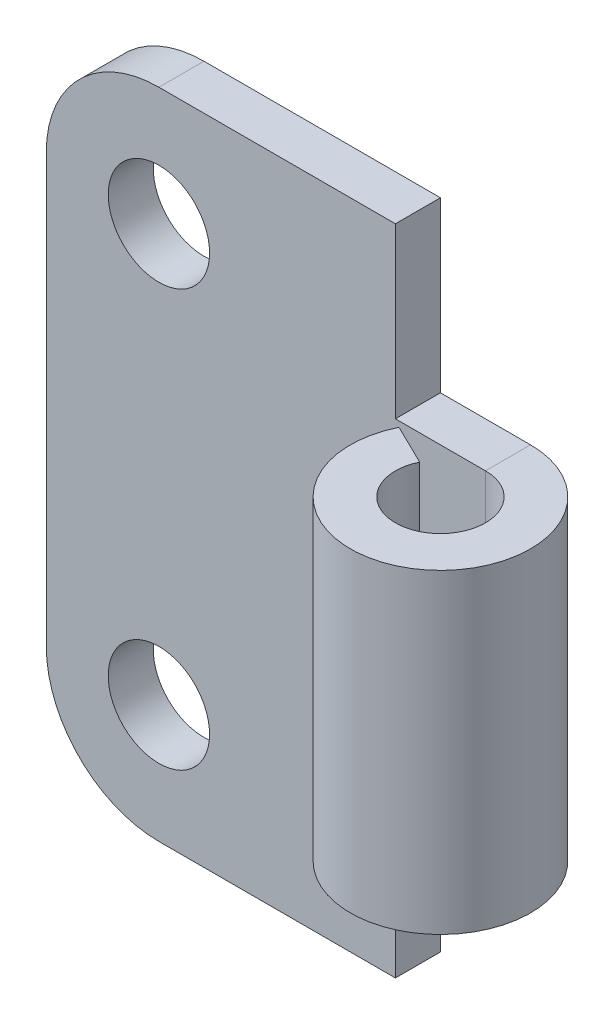
ISO-10303-21;
HEADER;
FILE_DESCRIPTION(('STEP AP214'),'2;1');
FILE_NAME('part.step','',(''),(''),'','','');
FILE_SCHEMA(('AUTOMOTIVE_DESIGN { 1 0 10303 214 1 1 1 1 }'));
ENDSEC;
DATA;
#1=APPLICATION_CONTEXT('core data for automotive mechanical design processes');
#2=APPLICATION_PROTOCOL_DEFINITION('international standard','automotive_design',2000,#1);
#3=PRODUCT_CONTEXT('',#1,'mechanical');
#4=PRODUCT('Part','Part','',(#3));
#5=PRODUCT_RELATED_PRODUCT_CATEGORY('part','',(#4));
#6=PRODUCT_DEFINITION_FORMATION('','',#4);
#7=PRODUCT_DEFINITION_CONTEXT('part definition',#1,'design');
#8=PRODUCT_DEFINITION('design','',#6,#7);
#9=PRODUCT_DEFINITION_SHAPE('','',#8);
#10=(LENGTH_UNIT() NAMED_UNIT(*) SI_UNIT(.MILLI.,.METRE.));
#11=(NAMED_UNIT(*) PLANE_ANGLE_UNIT() SI_UNIT($,.RADIAN.));
#12=(NAMED_UNIT(*) SI_UNIT($,.STERADIAN.) SOLID_ANGLE_UNIT());
#13=UNCERTAINTY_MEASURE_WITH_UNIT(LENGTH_MEASURE(1.E-05),#10,'distance_accuracy_value','');
#14=(GEOMETRIC_REPRESENTATION_CONTEXT(3) GLOBAL_UNCERTAINTY_ASSIGNED_CONTEXT((#13)) GLOBAL_UNIT_ASSIGNED_CONTEXT((#10,
#11,#12)) REPRESENTATION_CONTEXT('',''));
#15=CARTESIAN_POINT('',(0.,0.,0.));
#16=DIRECTION('',(0.,0.,1.));
#17=DIRECTION('',(1.,0.,0.));
#18=AXIS2_PLACEMENT_3D('',#15,#16,#17);
#19=CARTESIAN_POINT('',(15.5,-14.,-4.));
#20=DIRECTION('',(1.,0.,0.));
#21=DIRECTION('',(0.,0.,-1.));
#22=AXIS2_PLACEMENT_3D('',#19,#20,#21);
#23=PLANE('',#22);
#24=DIRECTION('',(0.,1.,0.));
#25=VECTOR('',#24,1.);
#26=CARTESIAN_POINT('',(15.5,-14.,0.));
#27=LINE('',#26,#25);
#28=CARTESIAN_POINT('',(15.5,-29.,0.));
#29=VERTEX_POINT('',#28);
#30=CARTESIAN_POINT('',(15.5,-14.,0.));
#31=VERTEX_POINT('',#30);
#32=EDGE_CURVE('E165',#29,#31,#27,.T.);
#33=ORIENTED_EDGE('',*,*,#32,.F.);
#34=DIRECTION('',(0.,0.,1.));
#35=VECTOR('',#34,1.);
#36=CARTESIAN_POINT('',(15.5,-29.,-4.));
#37=LINE('',#36,#35);
#38=CARTESIAN_POINT('',(15.5,-29.,-4.));
#39=VERTEX_POINT('',#38);
#40=EDGE_CURVE('E209',#39,#29,#37,.T.);
#41=ORIENTED_EDGE('',*,*,#40,.F.);
#42=DIRECTION('',(0.,1.,0.));
#43=VECTOR('',#42,1.);
#44=CARTESIAN_POINT('',(15.5,-14.,-4.));
#45=LINE('',#44,#43);
#46=CARTESIAN_POINT('',(15.5,-14.,-4.));
#47=VERTEX_POINT('',#46);
#48=EDGE_CURVE('E166',#39,#47,#45,.T.);
#49=ORIENTED_EDGE('',*,*,#48,.T.);
#50=DIRECTION('',(0.,0.,1.));
#51=VECTOR('',#50,1.);
#52=CARTESIAN_POINT('',(15.5,-14.,-4.));
#53=LINE('',#52,#51);
#54=EDGE_CURVE('E188',#47,#31,#53,.T.);
#55=ORIENTED_EDGE('',*,*,#54,.T.);
#56=EDGE_LOOP('',(#33,#41,#49,#55));
#57=FACE_BOUND('',#56,.T.);
#58=ADVANCED_FACE('F36',(#57),#23,.T.);
#59=CARTESIAN_POINT('',(-15.5,-29.,-4.));
#60=DIRECTION('',(0.,-1.,0.));
#61=DIRECTION('',(0.,0.,-1.));
#62=AXIS2_PLACEMENT_3D('',#59,#60,#61);
#63=PLANE('',#62);
#64=DIRECTION('',(1.,0.,0.));
#65=VECTOR('',#64,1.);
#66=CARTESIAN_POINT('',(-15.5,-29.,0.));
#67=LINE('',#66,#65);
#68=CARTESIAN_POINT('',(-5.5,-29.,0.));
#69=VERTEX_POINT('',#68);
#70=EDGE_CURVE('E170',#69,#29,#67,.T.);
#71=ORIENTED_EDGE('',*,*,#70,.F.);
#72=DIRECTION('',(0.,0.,1.));
#73=VECTOR('',#72,1.);
#74=CARTESIAN_POINT('',(-5.5,-29.,-4.));
#75=LINE('',#74,#73);
#76=CARTESIAN_POINT('',(-5.5,-29.,-4.));
#77=VERTEX_POINT('',#76);
#78=EDGE_CURVE('E59',#69,#77,#75,.F.);
#79=ORIENTED_EDGE('',*,*,#78,.T.);
#80=DIRECTION('',(1.,0.,0.));
#81=VECTOR('',#80,1.);
#82=CARTESIAN_POINT('',(-15.5,-29.,-4.));
#83=LINE('',#82,#81);
#84=EDGE_CURVE('E186',#77,#39,#83,.T.);
#85=ORIENTED_EDGE('',*,*,#84,.T.);
#86=ORIENTED_EDGE('',*,*,#40,.T.);
#87=EDGE_LOOP('',(#71,#79,#85,#86));
#88=FACE_BOUND('',#87,.T.);
#89=ADVANCED_FACE('F243',(#88),#63,.T.);
#90=CARTESIAN_POINT('',(-15.5,29.,-4.));
#91=DIRECTION('',(-1.,0.,0.));
#92=DIRECTION('',(0.,-1.,0.));
#93=AXIS2_PLACEMENT_3D('',#90,#91,#92);
#94=PLANE('',#93);
#95=DIRECTION('',(0.,-1.,0.));
#96=VECTOR('',#95,1.);
#97=CARTESIAN_POINT('',(-15.5,29.,-4.));
#98=LINE('',#97,#96);
#99=CARTESIAN_POINT('',(-15.5,19.,-4.));
#100=VERTEX_POINT('',#99);
#101=CARTESIAN_POINT('',(-15.5,-19.,-4.));
#102=VERTEX_POINT('',#101);
#103=EDGE_CURVE('E183',#100,#102,#98,.T.);
#104=ORIENTED_EDGE('',*,*,#103,.T.);
#105=DIRECTION('',(0.,0.,1.));
#106=VECTOR('',#105,1.);
#107=CARTESIAN_POINT('',(-15.5,-19.,-4.));
#108=LINE('',#107,#106);
#109=CARTESIAN_POINT('',(-15.5,-19.,0.));
#110=VERTEX_POINT('',#109);
#111=EDGE_CURVE('E223',#102,#110,#108,.T.);
#112=ORIENTED_EDGE('',*,*,#111,.T.);
#113=DIRECTION('',(0.,-1.,0.));
#114=VECTOR('',#113,1.);
#115=CARTESIAN_POINT('',(-15.5,29.,0.));
#116=LINE('',#115,#114);
#117=CARTESIAN_POINT('',(-15.5,19.,0.));
#118=VERTEX_POINT('',#117);
#119=EDGE_CURVE('E205',#118,#110,#116,.T.);
#120=ORIENTED_EDGE('',*,*,#119,.F.);
#121=DIRECTION('',(0.,0.,1.));
#122=VECTOR('',#121,1.);
#123=CARTESIAN_POINT('',(-15.5,19.,-4.));
#124=LINE('',#123,#122);
#125=EDGE_CURVE('E212',#118,#100,#124,.F.);
#126=ORIENTED_EDGE('',*,*,#125,.T.);
#127=EDGE_LOOP('',(#104,#112,#120,#126));
#128=FACE_BOUND('',#127,.T.);
#129=ADVANCED_FACE('F237',(#128),#94,.T.);
#130=CARTESIAN_POINT('',(-15.5,29.,-4.));
#131=DIRECTION('',(0.,1.,0.));
#132=DIRECTION('',(0.,0.,1.));
#133=AXIS2_PLACEMENT_3D('',#130,#131,#132);
#134=PLANE('',#133);
#135=DIRECTION('',(-1.,0.,0.));
#136=VECTOR('',#135,1.);
#137=CARTESIAN_POINT('',(-15.5,29.,-4.));
#138=LINE('',#137,#136);
#139=CARTESIAN_POINT('',(15.5,29.,-4.));
#140=VERTEX_POINT('',#139);
#141=CARTESIAN_POINT('',(-5.5,29.,-4.));
#142=VERTEX_POINT('',#141);
#143=EDGE_CURVE('E181',#140,#142,#138,.T.);
#144=ORIENTED_EDGE('',*,*,#143,.T.);
#145=DIRECTION('',(0.,0.,1.));
#146=VECTOR('',#145,1.);
#147=CARTESIAN_POINT('',(-5.5,29.,-4.));
#148=LINE('',#147,#146);
#149=CARTESIAN_POINT('',(-5.5,29.,0.));
#150=VERTEX_POINT('',#149);
#151=EDGE_CURVE('E11',#142,#150,#148,.T.);
#152=ORIENTED_EDGE('',*,*,#151,.T.);
#153=DIRECTION('',(-1.,0.,0.));
#154=VECTOR('',#153,1.);
#155=CARTESIAN_POINT('',(-15.5,29.,0.));
#156=LINE('',#155,#154);
#157=CARTESIAN_POINT('',(15.5,29.,0.));
#158=VERTEX_POINT('',#157);
#159=EDGE_CURVE('E202',#158,#150,#156,.T.);
#160=ORIENTED_EDGE('',*,*,#159,.F.);
#161=DIRECTION('',(0.,0.,1.));
#162=VECTOR('',#161,1.);
#163=CARTESIAN_POINT('',(15.5,29.,-4.));
#164=LINE('',#163,#162);
#165=EDGE_CURVE('E213',#140,#158,#164,.T.);
#166=ORIENTED_EDGE('',*,*,#165,.F.);
#167=EDGE_LOOP('',(#144,#152,#160,#166));
#168=FACE_BOUND('',#167,.T.);
#169=ADVANCED_FACE('F266',(#168),#134,.T.);
#170=CARTESIAN_POINT('',(15.5,29.,-4.));
#171=DIRECTION('',(1.,0.,0.));
#172=DIRECTION('',(0.,1.,0.));
#173=AXIS2_PLACEMENT_3D('',#170,#171,#172);
#174=PLANE('',#173);
#175=DIRECTION('',(0.,1.,0.));
#176=VECTOR('',#175,1.);
#177=CARTESIAN_POINT('',(15.5,29.,0.));
#178=LINE('',#177,#176);
#179=CARTESIAN_POINT('',(15.5,14.,0.));
#180=VERTEX_POINT('',#179);
#181=EDGE_CURVE('E199',#180,#158,#178,.T.);
#182=ORIENTED_EDGE('',*,*,#181,.F.);
#183=DIRECTION('',(0.,0.,1.));
#184=VECTOR('',#183,1.);
#185=CARTESIAN_POINT('',(15.5,14.,-4.));
#186=LINE('',#185,#184);
#187=CARTESIAN_POINT('',(15.5,14.,-4.));
#188=VERTEX_POINT('',#187);
#189=EDGE_CURVE('E215',#188,#180,#186,.T.);
#190=ORIENTED_EDGE('',*,*,#189,.F.);
#191=DIRECTION('',(0.,1.,0.));
#192=VECTOR('',#191,1.);
#193=CARTESIAN_POINT('',(15.5,29.,-4.));
#194=LINE('',#193,#192);
#195=EDGE_CURVE('E178',#188,#140,#194,.T.);
#196=ORIENTED_EDGE('',*,*,#195,.T.);
#197=ORIENTED_EDGE('',*,*,#165,.T.);
#198=EDGE_LOOP('',(#182,#190,#196,#197));
#199=FACE_BOUND('',#198,.T.);
#200=ADVANCED_FACE('F263',(#199),#174,.T.);
#201=CARTESIAN_POINT('',(15.5,14.,-4.));
#202=DIRECTION('',(0.,1.,0.));
#203=DIRECTION('',(0.,0.,1.));
#204=AXIS2_PLACEMENT_3D('',#201,#202,#203);
#205=PLANE('',#204);
#206=DIRECTION('',(-1.,0.,0.));
#207=VECTOR('',#206,1.);
#208=CARTESIAN_POINT('',(15.5,14.,0.));
#209=LINE('',#208,#207);
#210=CARTESIAN_POINT('',(23.5,14.,0.));
#211=VERTEX_POINT('',#210);
#212=EDGE_CURVE('E196',#211,#180,#209,.T.);
#213=ORIENTED_EDGE('',*,*,#212,.F.);
#214=DIRECTION('',(0.,0.,1.));
#215=VECTOR('',#214,1.);
#216=CARTESIAN_POINT('',(23.5,14.,-4.));
#217=LINE('',#216,#215);
#218=CARTESIAN_POINT('',(23.5,14.,-4.));
#219=VERTEX_POINT('',#218);
#220=EDGE_CURVE('E217',#219,#211,#217,.T.);
#221=ORIENTED_EDGE('',*,*,#220,.F.);
#222=DIRECTION('',(-1.,0.,0.));
#223=VECTOR('',#222,1.);
#224=CARTESIAN_POINT('',(15.5,14.,-4.));
#225=LINE('',#224,#223);
#226=EDGE_CURVE('E175',#219,#188,#225,.T.);
#227=ORIENTED_EDGE('',*,*,#226,.T.);
#228=ORIENTED_EDGE('',*,*,#189,.T.);
#229=EDGE_LOOP('',(#213,#221,#227,#228));
#230=FACE_BOUND('',#229,.T.);
#231=ADVANCED_FACE('F258',(#230),#205,.T.);
#232=CARTESIAN_POINT('',(23.5,-14.,-4.));
#233=DIRECTION('',(0.,-1.,0.));
#234=DIRECTION('',(0.,0.,-1.));
#235=AXIS2_PLACEMENT_3D('',#232,#233,#234);
#236=PLANE('',#235);
#237=DIRECTION('',(1.,0.,0.));
#238=VECTOR('',#237,1.);
#239=CARTESIAN_POINT('',(23.5,-14.,0.));
#240=LINE('',#239,#238);
#241=CARTESIAN_POINT('',(23.5,-14.,0.));
#242=VERTEX_POINT('',#241);
#243=EDGE_CURVE('E191',#31,#242,#240,.T.);
#244=ORIENTED_EDGE('',*,*,#243,.F.);
#245=ORIENTED_EDGE('',*,*,#54,.F.);
#246=DIRECTION('',(1.,0.,0.));
#247=VECTOR('',#246,1.);
#248=CARTESIAN_POINT('',(23.5,-14.,-4.));
#249=LINE('',#248,#247);
#250=CARTESIAN_POINT('',(23.5,-14.,-4.));
#251=VERTEX_POINT('',#250);
#252=EDGE_CURVE('E169',#47,#251,#249,.T.);
#253=ORIENTED_EDGE('',*,*,#252,.T.);
#254=DIRECTION('',(0.,0.,1.));
#255=VECTOR('',#254,1.);
#256=CARTESIAN_POINT('',(23.5,-14.,-4.));
#257=LINE('',#256,#255);
#258=EDGE_CURVE('E152',#251,#242,#257,.T.);
#259=ORIENTED_EDGE('',*,*,#258,.T.);
#260=EDGE_LOOP('',(#244,#245,#253,#259));
#261=FACE_BOUND('',#260,.T.);
#262=ADVANCED_FACE('F281',(#261),#236,.T.);
#263=CARTESIAN_POINT('',(0.,0.,-4.));
#264=DIRECTION('',(0.,0.,1.));
#265=DIRECTION('',(1.,0.,0.));
#266=AXIS2_PLACEMENT_3D('',#263,#264,#265);
#267=PLANE('',#266);
#268=CARTESIAN_POINT('',(-5.50000000000001,18.5,-4.));
#269=DIRECTION('',(0.,0.,1.));
#270=DIRECTION('',(1.,0.,0.));
#271=AXIS2_PLACEMENT_3D('',#268,#269,#270);
#272=CIRCLE('',#271,4.5);
#273=CARTESIAN_POINT('',(-1.00000000000001,18.5,-4.));
#274=VERTEX_POINT('',#273);
#275=EDGE_CURVE('E156',#274,#274,#272,.T.);
#276=ORIENTED_EDGE('',*,*,#275,.T.);
#277=EDGE_LOOP('',(#276));
#278=FACE_BOUND('',#277,.T.);
#279=CARTESIAN_POINT('',(-5.5,-18.5,-4.));
#280=DIRECTION('',(0.,0.,1.));
#281=DIRECTION('',(1.,0.,0.));
#282=AXIS2_PLACEMENT_3D('',#279,#280,#281);
#283=CIRCLE('',#282,4.5);
#284=CARTESIAN_POINT('',(-1.,-18.5,-4.));
#285=VERTEX_POINT('',#284);
#286=EDGE_CURVE('E322',#285,#285,#283,.T.);
#287=ORIENTED_EDGE('',*,*,#286,.T.);
#288=EDGE_LOOP('',(#287));
#289=FACE_BOUND('',#288,.T.);
#290=ORIENTED_EDGE('',*,*,#84,.F.);
#291=CARTESIAN_POINT('',(-5.5,-19.,-4.));
#292=DIRECTION('',(0.,0.,1.));
#293=DIRECTION('',(1.,0.,0.));
#294=AXIS2_PLACEMENT_3D('',#291,#292,#293);
#295=CIRCLE('',#294,10.);
#296=EDGE_CURVE('E44',#77,#102,#295,.F.);
#297=ORIENTED_EDGE('',*,*,#296,.T.);
#298=ORIENTED_EDGE('',*,*,#103,.F.);
#299=CARTESIAN_POINT('',(-5.5,19.,-4.));
#300=DIRECTION('',(0.,0.,1.));
#301=DIRECTION('',(1.,0.,0.));
#302=AXIS2_PLACEMENT_3D('',#299,#300,#301);
#303=CIRCLE('',#302,10.);
#304=EDGE_CURVE('E51',#100,#142,#303,.F.);
#305=ORIENTED_EDGE('',*,*,#304,.T.);
#306=ORIENTED_EDGE('',*,*,#143,.F.);
#307=ORIENTED_EDGE('',*,*,#195,.F.);
#308=ORIENTED_EDGE('',*,*,#226,.F.);
#309=DIRECTION('',(0.,1.,0.));
#310=VECTOR('',#309,1.);
#311=CARTESIAN_POINT('',(23.5,14.,-4.));
#312=LINE('',#311,#310);
#313=EDGE_CURVE('E173',#251,#219,#312,.T.);
#314=ORIENTED_EDGE('',*,*,#313,.F.);
#315=ORIENTED_EDGE('',*,*,#252,.F.);
#316=ORIENTED_EDGE('',*,*,#48,.F.);
#317=EDGE_LOOP('',(#290,#297,#298,#305,#306,#307,#308,#314,#315,#316));
#318=FACE_BOUND('',#317,.T.);
#319=ADVANCED_FACE('F232',(#278,#289,#318),#267,.F.);
#320=CARTESIAN_POINT('',(0.,0.,0.));
#321=DIRECTION('',(0.,0.,1.));
#322=DIRECTION('',(1.,0.,0.));
#323=AXIS2_PLACEMENT_3D('',#320,#321,#322);
#324=PLANE('',#323);
#325=CARTESIAN_POINT('',(-5.50000000000001,18.5,0.));
#326=DIRECTION('',(0.,0.,1.));
#327=DIRECTION('',(1.,0.,0.));
#328=AXIS2_PLACEMENT_3D('',#325,#326,#327);
#329=CIRCLE('',#328,4.5);
#330=CARTESIAN_POINT('',(-1.00000000000001,18.5,0.));
#331=VERTEX_POINT('',#330);
#332=EDGE_CURVE('E319',#331,#331,#329,.T.);
#333=ORIENTED_EDGE('',*,*,#332,.F.);
#334=EDGE_LOOP('',(#333));
#335=FACE_BOUND('',#334,.T.);
#336=CARTESIAN_POINT('',(-5.5,-18.5,0.));
#337=DIRECTION('',(0.,0.,1.));
#338=DIRECTION('',(1.,0.,0.));
#339=AXIS2_PLACEMENT_3D('',#336,#337,#338);
#340=CIRCLE('',#339,4.5);
#341=CARTESIAN_POINT('',(-1.,-18.5,0.));
#342=VERTEX_POINT('',#341);
#343=EDGE_CURVE('E326',#342,#342,#340,.T.);
#344=ORIENTED_EDGE('',*,*,#343,.F.);
#345=EDGE_LOOP('',(#344));
#346=FACE_BOUND('',#345,.T.);
#347=ORIENTED_EDGE('',*,*,#119,.T.);
#348=CARTESIAN_POINT('',(-5.5,-19.,0.));
#349=DIRECTION('',(0.,0.,1.));
#350=DIRECTION('',(1.,0.,0.));
#351=AXIS2_PLACEMENT_3D('',#348,#349,#350);
#352=CIRCLE('',#351,10.);
#353=EDGE_CURVE('E228',#110,#69,#352,.T.);
#354=ORIENTED_EDGE('',*,*,#353,.T.);
#355=ORIENTED_EDGE('',*,*,#70,.T.);
#356=ORIENTED_EDGE('',*,*,#32,.T.);
#357=ORIENTED_EDGE('',*,*,#243,.T.);
#358=DIRECTION('',(0.,1.,0.));
#359=VECTOR('',#358,1.);
#360=CARTESIAN_POINT('',(23.5,14.,0.));
#361=LINE('',#360,#359);
#362=EDGE_CURVE('E194',#242,#211,#361,.T.);
#363=ORIENTED_EDGE('',*,*,#362,.T.);
#364=ORIENTED_EDGE('',*,*,#212,.T.);
#365=ORIENTED_EDGE('',*,*,#181,.T.);
#366=ORIENTED_EDGE('',*,*,#159,.T.);
#367=CARTESIAN_POINT('',(-5.5,19.,0.));
#368=DIRECTION('',(0.,0.,1.));
#369=DIRECTION('',(1.,0.,0.));
#370=AXIS2_PLACEMENT_3D('',#367,#368,#369);
#371=CIRCLE('',#370,10.);
#372=EDGE_CURVE('E226',#150,#118,#371,.T.);
#373=ORIENTED_EDGE('',*,*,#372,.T.);
#374=EDGE_LOOP('',(#347,#354,#355,#356,#357,#363,#364,#365,#366,#373));
#375=FACE_BOUND('',#374,.T.);
#376=ADVANCED_FACE('F242',(#335,#346,#375),#324,.T.);
#377=CARTESIAN_POINT('',(19.9048238148034,0.,2.24651541284364));
#378=DIRECTION('',(-0.43837114678909,0.,0.898794046299161));
#379=DIRECTION('',(0.,1.,0.));
#380=AXIS2_PLACEMENT_3D('',#377,#378,#379);
#381=PLANE('',#380);
#382=DIRECTION('',(-0.898794046299161,0.,-0.43837114678909));
#383=VECTOR('',#382,1.);
#384=CARTESIAN_POINT('',(19.9048238148034,14.,2.24651541284364));
#385=LINE('',#384,#383);
#386=CARTESIAN_POINT('',(19.9048238148034,14.,2.24651541284364));
#387=VERTEX_POINT('',#386);
#388=CARTESIAN_POINT('',(16.3096476296067,14.,0.493030825687278));
#389=VERTEX_POINT('',#388);
#390=EDGE_CURVE('E138',#387,#389,#385,.T.);
#391=ORIENTED_EDGE('',*,*,#390,.F.);
#392=DIRECTION('',(0.,1.,0.));
#393=VECTOR('',#392,1.);
#394=CARTESIAN_POINT('',(19.9048238148034,14.,2.24651541284364));
#395=LINE('',#394,#393);
#396=CARTESIAN_POINT('',(19.9048238148034,-14.,2.24651541284364));
#397=VERTEX_POINT('',#396);
#398=EDGE_CURVE('E133',#397,#387,#395,.T.);
#399=ORIENTED_EDGE('',*,*,#398,.F.);
#400=DIRECTION('',(-0.898794046299161,0.,-0.43837114678909));
#401=VECTOR('',#400,1.);
#402=CARTESIAN_POINT('',(19.9048238148034,-14.,2.24651541284364));
#403=LINE('',#402,#401);
#404=CARTESIAN_POINT('',(16.3096476296067,-14.,0.493030825687278));
#405=VERTEX_POINT('',#404);
#406=EDGE_CURVE('E128',#397,#405,#403,.T.);
#407=ORIENTED_EDGE('',*,*,#406,.T.);
#408=DIRECTION('',(0.,1.,0.));
#409=VECTOR('',#408,1.);
#410=CARTESIAN_POINT('',(16.3096476296067,14.,0.493030825687278));
#411=LINE('',#410,#409);
#412=EDGE_CURVE('E131',#405,#389,#411,.T.);
#413=ORIENTED_EDGE('',*,*,#412,.T.);
#414=EDGE_LOOP('',(#391,#399,#407,#413));
#415=FACE_BOUND('',#414,.T.);
#416=ADVANCED_FACE('F130',(#415),#381,.F.);
#417=CARTESIAN_POINT('',(23.5,-14.,4.));
#418=DIRECTION('',(0.,-1.,0.));
#419=DIRECTION('',(0.,0.,-1.));
#420=AXIS2_PLACEMENT_3D('',#417,#418,#419);
#421=PLANE('',#420);
#422=ORIENTED_EDGE('',*,*,#406,.F.);
#423=CARTESIAN_POINT('',(23.5,-14.,4.));
#424=DIRECTION('',(0.,1.,0.));
#425=DIRECTION('',(0.,0.,1.));
#426=AXIS2_PLACEMENT_3D('',#423,#424,#425);
#427=CIRCLE('',#426,4.00000000000001);
#428=EDGE_CURVE('E148',#242,#397,#427,.F.);
#429=ORIENTED_EDGE('',*,*,#428,.F.);
#430=ORIENTED_EDGE('',*,*,#258,.F.);
#431=CARTESIAN_POINT('',(23.5,-14.,4.));
#432=DIRECTION('',(0.,1.,0.));
#433=DIRECTION('',(0.,0.,1.));
#434=AXIS2_PLACEMENT_3D('',#431,#432,#433);
#435=CIRCLE('',#434,8.00000000000001);
#436=EDGE_CURVE('E139',#251,#405,#435,.F.);
#437=ORIENTED_EDGE('',*,*,#436,.T.);
#438=EDGE_LOOP('',(#422,#429,#430,#437));
#439=FACE_BOUND('',#438,.T.);
#440=ADVANCED_FACE('F151',(#439),#421,.T.);
#441=CARTESIAN_POINT('',(23.5,14.,4.));
#442=DIRECTION('',(0.,-1.,0.));
#443=DIRECTION('',(0.,0.,-1.));
#444=AXIS2_PLACEMENT_3D('',#441,#442,#443);
#445=PLANE('',#444);
#446=CARTESIAN_POINT('',(23.5,14.,4.));
#447=DIRECTION('',(0.,1.,0.));
#448=DIRECTION('',(0.,0.,1.));
#449=AXIS2_PLACEMENT_3D('',#446,#447,#448);
#450=CIRCLE('',#449,4.00000000000001);
#451=EDGE_CURVE('E160',#387,#211,#450,.T.);
#452=ORIENTED_EDGE('',*,*,#451,.F.);
#453=ORIENTED_EDGE('',*,*,#390,.T.);
#454=CARTESIAN_POINT('',(23.5,14.,4.));
#455=DIRECTION('',(0.,1.,0.));
#456=DIRECTION('',(0.,0.,1.));
#457=AXIS2_PLACEMENT_3D('',#454,#455,#456);
#458=CIRCLE('',#457,8.00000000000001);
#459=EDGE_CURVE('E147',#389,#219,#458,.T.);
#460=ORIENTED_EDGE('',*,*,#459,.T.);
#461=ORIENTED_EDGE('',*,*,#220,.T.);
#462=EDGE_LOOP('',(#452,#453,#460,#461));
#463=FACE_BOUND('',#462,.T.);
#464=ADVANCED_FACE('F255',(#463),#445,.F.);
#465=CARTESIAN_POINT('',(23.5,14.,4.));
#466=DIRECTION('',(0.,1.,0.));
#467=DIRECTION('',(-0.898794046299161,0.,-0.43837114678909));
#468=AXIS2_PLACEMENT_3D('',#465,#466,#467);
#469=CYLINDRICAL_SURFACE('',#468,8.00000000000001);
#470=ORIENTED_EDGE('',*,*,#313,.T.);
#471=ORIENTED_EDGE('',*,*,#459,.F.);
#472=ORIENTED_EDGE('',*,*,#412,.F.);
#473=ORIENTED_EDGE('',*,*,#436,.F.);
#474=EDGE_LOOP('',(#470,#471,#472,#473));
#475=FACE_BOUND('',#474,.T.);
#476=ADVANCED_FACE('F145',(#475),#469,.T.);
#477=CARTESIAN_POINT('',(23.5,14.,4.));
#478=DIRECTION('',(0.,1.,0.));
#479=DIRECTION('',(-0.898794046299161,0.,-0.43837114678909));
#480=AXIS2_PLACEMENT_3D('',#477,#478,#479);
#481=CYLINDRICAL_SURFACE('',#480,4.00000000000001);
#482=ORIENTED_EDGE('',*,*,#362,.F.);
#483=ORIENTED_EDGE('',*,*,#428,.T.);
#484=ORIENTED_EDGE('',*,*,#398,.T.);
#485=ORIENTED_EDGE('',*,*,#451,.T.);
#486=EDGE_LOOP('',(#482,#483,#484,#485));
#487=FACE_BOUND('',#486,.T.);
#488=ADVANCED_FACE('F252',(#487),#481,.F.);
#489=CARTESIAN_POINT('',(-5.5,-18.5,-10.));
#490=DIRECTION('',(0.,0.,1.));
#491=DIRECTION('',(1.,0.,0.));
#492=AXIS2_PLACEMENT_3D('',#489,#490,#491);
#493=CYLINDRICAL_SURFACE('',#492,4.5);
#494=ORIENTED_EDGE('',*,*,#343,.T.);
#495=EDGE_LOOP('',(#494));
#496=FACE_BOUND('',#495,.T.);
#497=ORIENTED_EDGE('',*,*,#286,.F.);
#498=EDGE_LOOP('',(#497));
#499=FACE_BOUND('',#498,.T.);
#500=ADVANCED_FACE('F306',(#496,#499),#493,.F.);
#501=CARTESIAN_POINT('',(-5.50000000000001,18.5,-10.));
#502=DIRECTION('',(0.,0.,1.));
#503=DIRECTION('',(1.,0.,0.));
#504=AXIS2_PLACEMENT_3D('',#501,#502,#503);
#505=CYLINDRICAL_SURFACE('',#504,4.5);
#506=ORIENTED_EDGE('',*,*,#332,.T.);
#507=EDGE_LOOP('',(#506));
#508=FACE_BOUND('',#507,.T.);
#509=ORIENTED_EDGE('',*,*,#275,.F.);
#510=EDGE_LOOP('',(#509));
#511=FACE_BOUND('',#510,.T.);
#512=ADVANCED_FACE('F273',(#508,#511),#505,.F.);
#513=CARTESIAN_POINT('',(-5.5,-19.,-4.));
#514=DIRECTION('',(0.,0.,1.));
#515=DIRECTION('',(1.,0.,0.));
#516=AXIS2_PLACEMENT_3D('',#513,#514,#515);
#517=CYLINDRICAL_SURFACE('',#516,10.);
#518=ORIENTED_EDGE('',*,*,#296,.F.);
#519=ORIENTED_EDGE('',*,*,#78,.F.);
#520=ORIENTED_EDGE('',*,*,#353,.F.);
#521=ORIENTED_EDGE('',*,*,#111,.F.);
#522=EDGE_LOOP('',(#518,#519,#520,#521));
#523=FACE_BOUND('',#522,.T.);
#524=ADVANCED_FACE('F240',(#523),#517,.T.);
#525=CARTESIAN_POINT('',(-5.5,19.,-4.));
#526=DIRECTION('',(0.,0.,1.));
#527=DIRECTION('',(1.,0.,0.));
#528=AXIS2_PLACEMENT_3D('',#525,#526,#527);
#529=CYLINDRICAL_SURFACE('',#528,10.);
#530=ORIENTED_EDGE('',*,*,#304,.F.);
#531=ORIENTED_EDGE('',*,*,#125,.F.);
#532=ORIENTED_EDGE('',*,*,#372,.F.);
#533=ORIENTED_EDGE('',*,*,#151,.F.);
#534=EDGE_LOOP('',(#530,#531,#532,#533));
#535=FACE_BOUND('',#534,.T.);
#536=ADVANCED_FACE('F38',(#535),#529,.T.);
#537=CLOSED_SHELL('',(#58,#89,#129,#169,#200,#231,#262,#319,#376,#416,#440,#464,#476,#488,#500,
#512,#524,#536));
#538=MANIFOLD_SOLID_BREP('B2',#537);
#539=ADVANCED_BREP_SHAPE_REPRESENTATION('',(#18,#538),#14);
#540=SHAPE_DEFINITION_REPRESENTATION(#9,#539);
ENDSEC;
END-ISO-10303-21;
